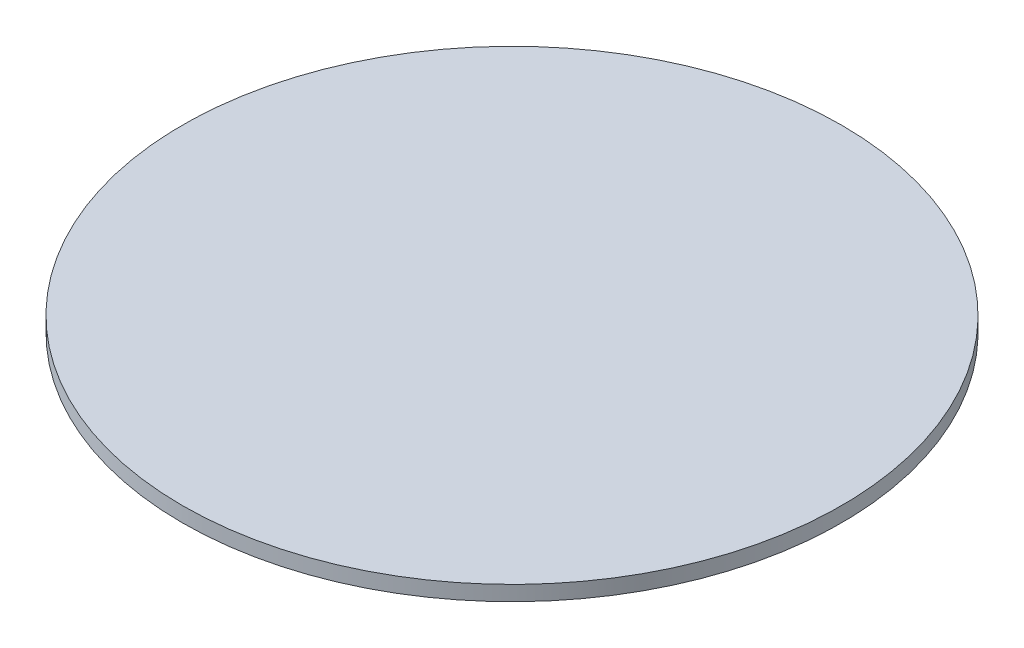
ISO-10303-21;
HEADER;
FILE_DESCRIPTION(('STEP AP214'),'2;1');
FILE_NAME('part.step','',(''),(''),'','','');
FILE_SCHEMA(('AUTOMOTIVE_DESIGN { 1 0 10303 214 1 1 1 1 }'));
ENDSEC;
DATA;
#1=APPLICATION_CONTEXT('core data for automotive mechanical design processes');
#2=APPLICATION_PROTOCOL_DEFINITION('international standard','automotive_design',2000,#1);
#3=PRODUCT_CONTEXT('',#1,'mechanical');
#4=PRODUCT('Part','Part','',(#3));
#5=PRODUCT_RELATED_PRODUCT_CATEGORY('part','',(#4));
#6=PRODUCT_DEFINITION_FORMATION('','',#4);
#7=PRODUCT_DEFINITION_CONTEXT('part definition',#1,'design');
#8=PRODUCT_DEFINITION('design','',#6,#7);
#9=PRODUCT_DEFINITION_SHAPE('','',#8);
#10=(LENGTH_UNIT() NAMED_UNIT(*) SI_UNIT(.MILLI.,.METRE.));
#11=(NAMED_UNIT(*) PLANE_ANGLE_UNIT() SI_UNIT($,.RADIAN.));
#12=(NAMED_UNIT(*) SI_UNIT($,.STERADIAN.) SOLID_ANGLE_UNIT());
#13=UNCERTAINTY_MEASURE_WITH_UNIT(LENGTH_MEASURE(1.E-05),#10,'distance_accuracy_value','');
#14=(GEOMETRIC_REPRESENTATION_CONTEXT(3) GLOBAL_UNCERTAINTY_ASSIGNED_CONTEXT((#13)) GLOBAL_UNIT_ASSIGNED_CONTEXT((#10,
#11,#12)) REPRESENTATION_CONTEXT('',''));
#15=CARTESIAN_POINT('',(0.,0.,0.));
#16=DIRECTION('',(0.,0.,1.));
#17=DIRECTION('',(1.,0.,0.));
#18=AXIS2_PLACEMENT_3D('',#15,#16,#17);
#19=CARTESIAN_POINT('',(0.,-2.,0.));
#20=DIRECTION('',(0.,1.,0.));
#21=DIRECTION('',(0.,0.,1.));
#22=AXIS2_PLACEMENT_3D('',#19,#20,#21);
#23=CYLINDRICAL_SURFACE('',#22,44.);
#24=CARTESIAN_POINT('',(0.,-2.,0.));
#25=DIRECTION('',(0.,1.,0.));
#26=DIRECTION('',(0.,0.,1.));
#27=AXIS2_PLACEMENT_3D('',#24,#25,#26);
#28=CIRCLE('',#27,44.);
#29=CARTESIAN_POINT('',(0.,-2.,44.));
#30=VERTEX_POINT('',#29);
#31=EDGE_CURVE('E10',#30,#30,#28,.T.);
#32=ORIENTED_EDGE('',*,*,#31,.T.);
#33=EDGE_LOOP('',(#32));
#34=FACE_BOUND('',#33,.T.);
#35=CARTESIAN_POINT('',(0.,0.,0.));
#36=DIRECTION('',(0.,1.,0.));
#37=DIRECTION('',(0.,0.,1.));
#38=AXIS2_PLACEMENT_3D('',#35,#36,#37);
#39=CIRCLE('',#38,44.);
#40=CARTESIAN_POINT('',(0.,0.,44.));
#41=VERTEX_POINT('',#40);
#42=EDGE_CURVE('E35',#41,#41,#39,.T.);
#43=ORIENTED_EDGE('',*,*,#42,.F.);
#44=EDGE_LOOP('',(#43));
#45=FACE_BOUND('',#44,.T.);
#46=ADVANCED_FACE('F32',(#34,#45),#23,.T.);
#47=CARTESIAN_POINT('',(0.,-2.,0.));
#48=DIRECTION('',(0.,1.,0.));
#49=DIRECTION('',(0.,0.,1.));
#50=AXIS2_PLACEMENT_3D('',#47,#48,#49);
#51=PLANE('',#50);
#52=ORIENTED_EDGE('',*,*,#31,.F.);
#53=EDGE_LOOP('',(#52));
#54=FACE_BOUND('',#53,.T.);
#55=ADVANCED_FACE('F47',(#54),#51,.F.);
#56=CARTESIAN_POINT('',(0.,0.,0.));
#57=DIRECTION('',(0.,1.,0.));
#58=DIRECTION('',(0.,0.,1.));
#59=AXIS2_PLACEMENT_3D('',#56,#57,#58);
#60=PLANE('',#59);
#61=ORIENTED_EDGE('',*,*,#42,.T.);
#62=EDGE_LOOP('',(#61));
#63=FACE_BOUND('',#62,.T.);
#64=ADVANCED_FACE('F44',(#63),#60,.T.);
#65=CLOSED_SHELL('',(#46,#55,#64));
#66=MANIFOLD_SOLID_BREP('B2',#65);
#67=ADVANCED_BREP_SHAPE_REPRESENTATION('',(#18,#66),#14);
#68=SHAPE_DEFINITION_REPRESENTATION(#9,#67);
ENDSEC;
END-ISO-10303-21;
